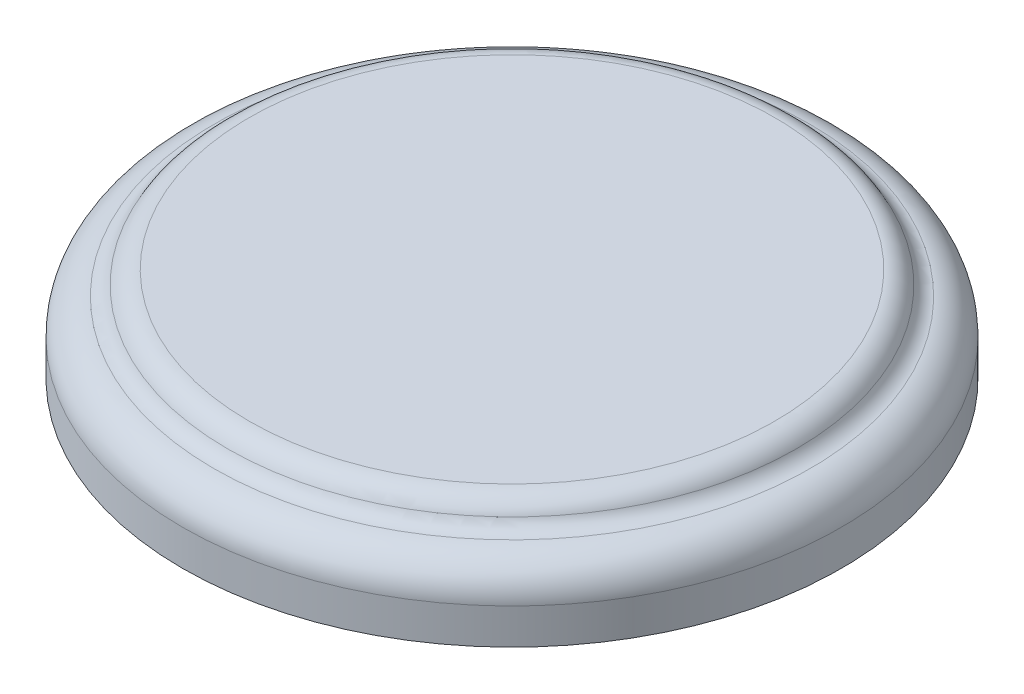
ISO-10303-21;
HEADER;
FILE_DESCRIPTION(('STEP AP214'),'2;1');
FILE_NAME('part.step','',(''),(''),'','','');
FILE_SCHEMA(('AUTOMOTIVE_DESIGN { 1 0 10303 214 1 1 1 1 }'));
ENDSEC;
DATA;
#1=APPLICATION_CONTEXT('core data for automotive mechanical design processes');
#2=APPLICATION_PROTOCOL_DEFINITION('international standard','automotive_design',2000,#1);
#3=PRODUCT_CONTEXT('',#1,'mechanical');
#4=PRODUCT('Part','Part','',(#3));
#5=PRODUCT_RELATED_PRODUCT_CATEGORY('part','',(#4));
#6=PRODUCT_DEFINITION_FORMATION('','',#4);
#7=PRODUCT_DEFINITION_CONTEXT('part definition',#1,'design');
#8=PRODUCT_DEFINITION('design','',#6,#7);
#9=PRODUCT_DEFINITION_SHAPE('','',#8);
#10=(LENGTH_UNIT() NAMED_UNIT(*) SI_UNIT(.MILLI.,.METRE.));
#11=(NAMED_UNIT(*) PLANE_ANGLE_UNIT() SI_UNIT($,.RADIAN.));
#12=(NAMED_UNIT(*) SI_UNIT($,.STERADIAN.) SOLID_ANGLE_UNIT());
#13=UNCERTAINTY_MEASURE_WITH_UNIT(LENGTH_MEASURE(1.E-05),#10,'distance_accuracy_value','');
#14=(GEOMETRIC_REPRESENTATION_CONTEXT(3) GLOBAL_UNCERTAINTY_ASSIGNED_CONTEXT((#13)) GLOBAL_UNIT_ASSIGNED_CONTEXT((#10,
#11,#12)) REPRESENTATION_CONTEXT('',''));
#15=CARTESIAN_POINT('',(0.,0.,0.));
#16=DIRECTION('',(0.,0.,1.));
#17=DIRECTION('',(1.,0.,0.));
#18=AXIS2_PLACEMENT_3D('',#15,#16,#17);
#19=CARTESIAN_POINT('',(0.,0.,0.));
#20=DIRECTION('',(0.,-1.,0.));
#21=DIRECTION('',(0.,0.,-1.));
#22=AXIS2_PLACEMENT_3D('',#19,#20,#21);
#23=PLANE('',#22);
#24=CARTESIAN_POINT('',(0.,0.,0.));
#25=DIRECTION('',(0.,-1.,0.));
#26=DIRECTION('',(0.,0.,-1.));
#27=AXIS2_PLACEMENT_3D('',#24,#25,#26);
#28=CIRCLE('',#27,174.625);
#29=CARTESIAN_POINT('',(0.,0.,-174.625));
#30=VERTEX_POINT('',#29);
#31=EDGE_CURVE('E57',#30,#30,#28,.F.);
#32=ORIENTED_EDGE('',*,*,#31,.T.);
#33=EDGE_LOOP('',(#32));
#34=FACE_BOUND('',#33,.T.);
#35=CARTESIAN_POINT('',(0.,0.,0.));
#36=DIRECTION('',(0.,1.,0.));
#37=DIRECTION('',(0.,0.,1.));
#38=AXIS2_PLACEMENT_3D('',#35,#36,#37);
#39=CIRCLE('',#38,177.8);
#40=CARTESIAN_POINT('',(0.,0.,177.8));
#41=VERTEX_POINT('',#40);
#42=EDGE_CURVE('E53',#41,#41,#39,.T.);
#43=ORIENTED_EDGE('',*,*,#42,.F.);
#44=EDGE_LOOP('',(#43));
#45=FACE_BOUND('',#44,.T.);
#46=ADVANCED_FACE('F33',(#34,#45),#23,.T.);
#47=CARTESIAN_POINT('',(0.,50.8,0.));
#48=DIRECTION('',(0.,1.,0.));
#49=DIRECTION('',(0.,0.,1.));
#50=AXIS2_PLACEMENT_3D('',#47,#48,#49);
#51=CYLINDRICAL_SURFACE('',#50,177.8);
#52=CARTESIAN_POINT('',(0.,19.2269366857527,0.));
#53=DIRECTION('',(0.,-1.,0.));
#54=DIRECTION('',(0.,0.,-1.));
#55=AXIS2_PLACEMENT_3D('',#52,#53,#54);
#56=CIRCLE('',#55,177.8);
#57=CARTESIAN_POINT('',(0.,19.2269366857527,-177.8));
#58=VERTEX_POINT('',#57);
#59=EDGE_CURVE('E44',#58,#58,#56,.T.);
#60=ORIENTED_EDGE('',*,*,#59,.T.);
#61=EDGE_LOOP('',(#60));
#62=FACE_BOUND('',#61,.T.);
#63=ORIENTED_EDGE('',*,*,#42,.T.);
#64=EDGE_LOOP('',(#63));
#65=FACE_BOUND('',#64,.T.);
#66=ADVANCED_FACE('F84',(#62,#65),#51,.T.);
#67=CARTESIAN_POINT('',(0.,50.8,152.4));
#68=DIRECTION('',(0.,1.,0.));
#69=DIRECTION('',(0.,0.,1.));
#70=AXIS2_PLACEMENT_3D('',#67,#68,#69);
#71=PLANE('',#70);
#72=CARTESIAN_POINT('',(0.,50.8,0.));
#73=DIRECTION('',(0.,1.,0.));
#74=DIRECTION('',(0.,0.,1.));
#75=AXIS2_PLACEMENT_3D('',#72,#73,#74);
#76=CIRCLE('',#75,141.844536857931);
#77=CARTESIAN_POINT('',(0.,50.8,141.844536857931));
#78=VERTEX_POINT('',#77);
#79=EDGE_CURVE('E40',#78,#78,#76,.T.);
#80=ORIENTED_EDGE('',*,*,#79,.T.);
#81=EDGE_LOOP('',(#80));
#82=FACE_BOUND('',#81,.T.);
#83=ADVANCED_FACE('F89',(#82),#71,.T.);
#84=CARTESIAN_POINT('',(0.,47.625,0.));
#85=DIRECTION('',(0.,1.,0.));
#86=DIRECTION('',(0.,0.,1.));
#87=AXIS2_PLACEMENT_3D('',#84,#85,#86);
#88=TOROIDAL_SURFACE('',#87,161.925,9.525);
#89=CARTESIAN_POINT('',(0.,43.542857142857,0.));
#90=DIRECTION('',(0.,1.,0.));
#91=DIRECTION('',(0.,0.,1.));
#92=AXIS2_PLACEMENT_3D('',#89,#90,#91);
#93=CIRCLE('',#92,153.319087224827);
#94=CARTESIAN_POINT('',(0.,43.542857142857,153.319087224827));
#95=VERTEX_POINT('',#94);
#96=EDGE_CURVE('E10',#95,#95,#93,.F.);
#97=ORIENTED_EDGE('',*,*,#96,.T.);
#98=EDGE_LOOP('',(#97));
#99=FACE_BOUND('',#98,.T.);
#100=CARTESIAN_POINT('',(0.,38.1589788952258,0.));
#101=DIRECTION('',(0.,1.,0.));
#102=DIRECTION('',(0.,0.,1.));
#103=AXIS2_PLACEMENT_3D('',#100,#101,#102);
#104=CIRCLE('',#103,160.866666666664);
#105=CARTESIAN_POINT('',(0.,38.1589788952258,160.866666666664));
#106=VERTEX_POINT('',#105);
#107=EDGE_CURVE('E48',#106,#106,#104,.T.);
#108=ORIENTED_EDGE('',*,*,#107,.T.);
#109=EDGE_LOOP('',(#108));
#110=FACE_BOUND('',#109,.T.);
#111=ADVANCED_FACE('F95',(#99,#110),#88,.F.);
#112=CARTESIAN_POINT('',(0.,19.2269366857527,0.));
#113=DIRECTION('',(0.,-1.,0.));
#114=DIRECTION('',(0.,0.,-1.));
#115=AXIS2_PLACEMENT_3D('',#112,#113,#114);
#116=TOROIDAL_SURFACE('',#115,158.75,19.05);
#117=ORIENTED_EDGE('',*,*,#59,.F.);
#118=EDGE_LOOP('',(#117));
#119=FACE_BOUND('',#118,.T.);
#120=ORIENTED_EDGE('',*,*,#107,.F.);
#121=EDGE_LOOP('',(#120));
#122=FACE_BOUND('',#121,.T.);
#123=ADVANCED_FACE('F100',(#119,#122),#116,.T.);
#124=CARTESIAN_POINT('',(0.,38.1,0.));
#125=DIRECTION('',(0.,-1.,0.));
#126=DIRECTION('',(0.,0.,-1.));
#127=AXIS2_PLACEMENT_3D('',#124,#125,#126);
#128=TOROIDAL_SURFACE('',#127,141.844536857931,12.7);
#129=ORIENTED_EDGE('',*,*,#96,.F.);
#130=EDGE_LOOP('',(#129));
#131=FACE_BOUND('',#130,.T.);
#132=ORIENTED_EDGE('',*,*,#79,.F.);
#133=EDGE_LOOP('',(#132));
#134=FACE_BOUND('',#133,.T.);
#135=ADVANCED_FACE('F35',(#131,#134),#128,.T.);
#136=CARTESIAN_POINT('',(0.,50.8,0.));
#137=DIRECTION('',(0.,1.,0.));
#138=DIRECTION('',(0.,0.,1.));
#139=AXIS2_PLACEMENT_3D('',#136,#137,#138);
#140=CYLINDRICAL_SURFACE('',#139,174.625);
#141=CARTESIAN_POINT('',(0.,19.2269366857527,0.));
#142=DIRECTION('',(0.,1.,0.));
#143=DIRECTION('',(0.,0.,1.));
#144=AXIS2_PLACEMENT_3D('',#141,#142,#143);
#145=CIRCLE('',#144,174.625);
#146=CARTESIAN_POINT('',(0.,19.2269366857527,174.625));
#147=VERTEX_POINT('',#146);
#148=EDGE_CURVE('E64',#147,#147,#145,.F.);
#149=ORIENTED_EDGE('',*,*,#148,.F.);
#150=EDGE_LOOP('',(#149));
#151=FACE_BOUND('',#150,.T.);
#152=ORIENTED_EDGE('',*,*,#31,.F.);
#153=EDGE_LOOP('',(#152));
#154=FACE_BOUND('',#153,.T.);
#155=ADVANCED_FACE('F75',(#151,#154),#140,.F.);
#156=CARTESIAN_POINT('',(0.,47.625,152.4));
#157=DIRECTION('',(0.,1.,0.));
#158=DIRECTION('',(0.,0.,1.));
#159=AXIS2_PLACEMENT_3D('',#156,#157,#158);
#160=PLANE('',#159);
#161=CARTESIAN_POINT('',(0.,47.625,0.));
#162=DIRECTION('',(0.,-1.,0.));
#163=DIRECTION('',(0.,0.,-1.));
#164=AXIS2_PLACEMENT_3D('',#161,#162,#163);
#165=CIRCLE('',#164,141.844536857931);
#166=CARTESIAN_POINT('',(0.,47.625,-141.844536857931));
#167=VERTEX_POINT('',#166);
#168=EDGE_CURVE('E61',#167,#167,#165,.F.);
#169=ORIENTED_EDGE('',*,*,#168,.F.);
#170=EDGE_LOOP('',(#169));
#171=FACE_BOUND('',#170,.T.);
#172=ADVANCED_FACE('F78',(#171),#160,.F.);
#173=CARTESIAN_POINT('',(0.,47.625,0.));
#174=DIRECTION('',(0.,1.,0.));
#175=DIRECTION('',(0.,0.,1.));
#176=AXIS2_PLACEMENT_3D('',#173,#174,#175);
#177=TOROIDAL_SURFACE('',#176,161.925,12.7);
#178=CARTESIAN_POINT('',(0.,42.1821428571428,0.));
#179=DIRECTION('',(0.,1.,0.));
#180=DIRECTION('',(0.,0.,1.));
#181=AXIS2_PLACEMENT_3D('',#178,#179,#180);
#182=CIRCLE('',#181,150.450449633103);
#183=CARTESIAN_POINT('',(0.,42.1821428571428,150.450449633103));
#184=VERTEX_POINT('',#183);
#185=EDGE_CURVE('E56',#184,#184,#182,.F.);
#186=ORIENTED_EDGE('',*,*,#185,.F.);
#187=EDGE_LOOP('',(#186));
#188=FACE_BOUND('',#187,.T.);
#189=CARTESIAN_POINT('',(0.,35.0036385270012,0.));
#190=DIRECTION('',(0.,1.,0.));
#191=DIRECTION('',(0.,0.,1.));
#192=AXIS2_PLACEMENT_3D('',#189,#190,#191);
#193=CIRCLE('',#192,160.513888888889);
#194=CARTESIAN_POINT('',(0.,35.0036385270012,160.513888888889));
#195=VERTEX_POINT('',#194);
#196=EDGE_CURVE('E60',#195,#195,#193,.T.);
#197=ORIENTED_EDGE('',*,*,#196,.F.);
#198=EDGE_LOOP('',(#197));
#199=FACE_BOUND('',#198,.T.);
#200=ADVANCED_FACE('F126',(#188,#199),#177,.T.);
#201=CARTESIAN_POINT('',(0.,19.2269366857527,0.));
#202=DIRECTION('',(0.,-1.,0.));
#203=DIRECTION('',(0.,0.,-1.));
#204=AXIS2_PLACEMENT_3D('',#201,#202,#203);
#205=TOROIDAL_SURFACE('',#204,158.75,15.875);
#206=ORIENTED_EDGE('',*,*,#148,.T.);
#207=EDGE_LOOP('',(#206));
#208=FACE_BOUND('',#207,.T.);
#209=ORIENTED_EDGE('',*,*,#196,.T.);
#210=EDGE_LOOP('',(#209));
#211=FACE_BOUND('',#210,.T.);
#212=ADVANCED_FACE('F72',(#208,#211),#205,.F.);
#213=CARTESIAN_POINT('',(0.,38.1,0.));
#214=DIRECTION('',(0.,-1.,0.));
#215=DIRECTION('',(0.,0.,-1.));
#216=AXIS2_PLACEMENT_3D('',#213,#214,#215);
#217=TOROIDAL_SURFACE('',#216,141.844536857931,9.525);
#218=ORIENTED_EDGE('',*,*,#185,.T.);
#219=EDGE_LOOP('',(#218));
#220=FACE_BOUND('',#219,.T.);
#221=ORIENTED_EDGE('',*,*,#168,.T.);
#222=EDGE_LOOP('',(#221));
#223=FACE_BOUND('',#222,.T.);
#224=ADVANCED_FACE('F141',(#220,#223),#217,.F.);
#225=CLOSED_SHELL('',(#46,#66,#83,#111,#123,#135,#155,#172,#200,#212,#224));
#226=MANIFOLD_SOLID_BREP('B2',#225);
#227=ADVANCED_BREP_SHAPE_REPRESENTATION('',(#18,#226),#14);
#228=SHAPE_DEFINITION_REPRESENTATION(#9,#227);
ENDSEC;
END-ISO-10303-21;
